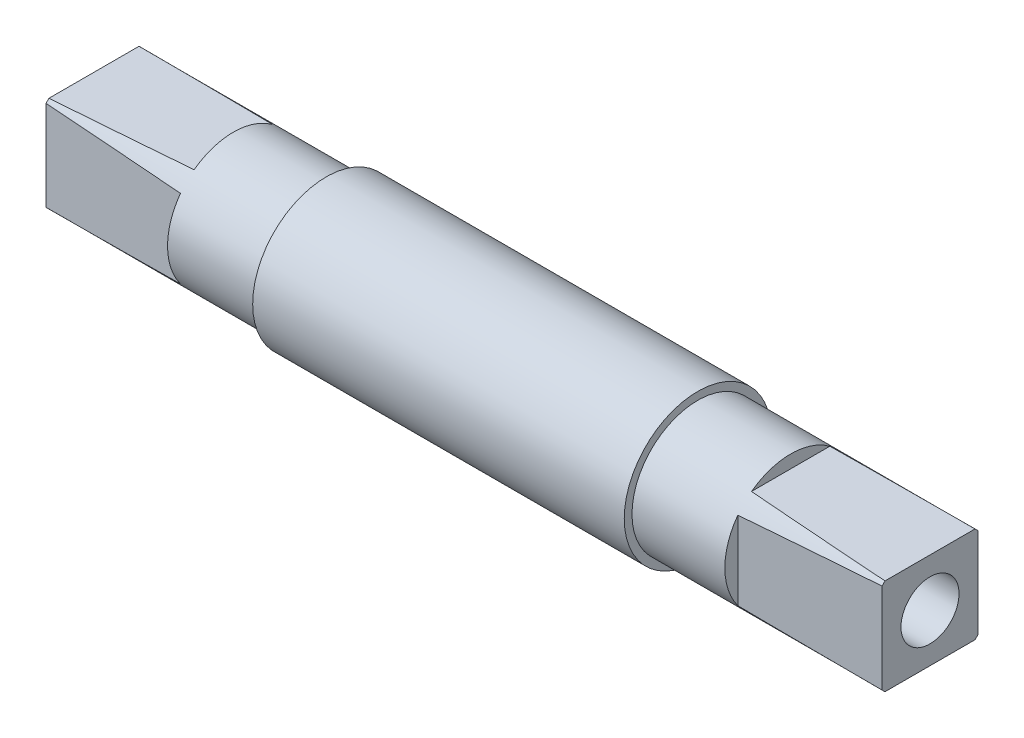
ISO-10303-21;
HEADER;
FILE_DESCRIPTION(('STEP AP214'),'2;1');
FILE_NAME('part.step','',(''),(''),'','','');
FILE_SCHEMA(('AUTOMOTIVE_DESIGN { 1 0 10303 214 1 1 1 1 }'));
ENDSEC;
DATA;
#1=APPLICATION_CONTEXT('core data for automotive mechanical design processes');
#2=APPLICATION_PROTOCOL_DEFINITION('international standard','automotive_design',2000,#1);
#3=PRODUCT_CONTEXT('',#1,'mechanical');
#4=PRODUCT('Part','Part','',(#3));
#5=PRODUCT_RELATED_PRODUCT_CATEGORY('part','',(#4));
#6=PRODUCT_DEFINITION_FORMATION('','',#4);
#7=PRODUCT_DEFINITION_CONTEXT('part definition',#1,'design');
#8=PRODUCT_DEFINITION('design','',#6,#7);
#9=PRODUCT_DEFINITION_SHAPE('','',#8);
#10=(LENGTH_UNIT() NAMED_UNIT(*) SI_UNIT(.MILLI.,.METRE.));
#11=(NAMED_UNIT(*) PLANE_ANGLE_UNIT() SI_UNIT($,.RADIAN.));
#12=(NAMED_UNIT(*) SI_UNIT($,.STERADIAN.) SOLID_ANGLE_UNIT());
#13=UNCERTAINTY_MEASURE_WITH_UNIT(LENGTH_MEASURE(1.E-05),#10,'distance_accuracy_value','');
#14=(GEOMETRIC_REPRESENTATION_CONTEXT(3) GLOBAL_UNCERTAINTY_ASSIGNED_CONTEXT((#13)) GLOBAL_UNIT_ASSIGNED_CONTEXT((#10,
#11,#12)) REPRESENTATION_CONTEXT('',''));
#15=CARTESIAN_POINT('',(0.,0.,0.));
#16=DIRECTION('',(0.,0.,1.));
#17=DIRECTION('',(1.,0.,0.));
#18=AXIS2_PLACEMENT_3D('',#15,#16,#17);
#19=CARTESIAN_POINT('',(-69.5075980392157,0.,0.));
#20=DIRECTION('',(-1.,0.,0.));
#21=DIRECTION('',(0.,0.,1.));
#22=AXIS2_PLACEMENT_3D('',#19,#20,#21);
#23=CYLINDRICAL_SURFACE('',#22,3.5);
#24=CARTESIAN_POINT('',(42.,0.,0.));
#25=DIRECTION('',(-1.,0.,0.));
#26=DIRECTION('',(0.,0.,1.));
#27=AXIS2_PLACEMENT_3D('',#24,#25,#26);
#28=CIRCLE('',#27,3.5);
#29=CARTESIAN_POINT('',(42.,0.,3.5));
#30=VERTEX_POINT('',#29);
#31=EDGE_CURVE('E19',#30,#30,#28,.F.);
#32=ORIENTED_EDGE('',*,*,#31,.T.);
#33=EDGE_LOOP('',(#32));
#34=FACE_BOUND('',#33,.T.);
#35=CARTESIAN_POINT('',(-42.,0.,0.));
#36=DIRECTION('',(-1.,0.,0.));
#37=DIRECTION('',(0.,0.,1.));
#38=AXIS2_PLACEMENT_3D('',#35,#36,#37);
#39=CIRCLE('',#38,3.5);
#40=CARTESIAN_POINT('',(-42.,0.,3.5));
#41=VERTEX_POINT('',#40);
#42=EDGE_CURVE('E215',#41,#41,#39,.T.);
#43=ORIENTED_EDGE('',*,*,#42,.T.);
#44=EDGE_LOOP('',(#43));
#45=FACE_BOUND('',#44,.T.);
#46=ADVANCED_FACE('F16',(#34,#45),#23,.F.);
#47=CARTESIAN_POINT('',(42.,3.75,0.));
#48=DIRECTION('',(-1.,0.,0.));
#49=DIRECTION('',(0.,0.,1.));
#50=AXIS2_PLACEMENT_3D('',#47,#48,#49);
#51=PLANE('',#50);
#52=ORIENTED_EDGE('',*,*,#31,.F.);
#53=EDGE_LOOP('',(#52));
#54=FACE_BOUND('',#53,.T.);
#55=CARTESIAN_POINT('',(42.,0.,0.));
#56=DIRECTION('',(-1.,0.,0.));
#57=DIRECTION('',(0.,0.,1.));
#58=AXIS2_PLACEMENT_3D('',#55,#56,#57);
#59=CIRCLE('',#58,3.75);
#60=CARTESIAN_POINT('',(42.,0.,3.75));
#61=VERTEX_POINT('',#60);
#62=EDGE_CURVE('E213',#61,#61,#59,.F.);
#63=ORIENTED_EDGE('',*,*,#62,.T.);
#64=EDGE_LOOP('',(#63));
#65=FACE_BOUND('',#64,.T.);
#66=ADVANCED_FACE('F223',(#54,#65),#51,.F.);
#67=CARTESIAN_POINT('',(-42.,3.74999999999999,0.));
#68=DIRECTION('',(1.,0.,0.));
#69=DIRECTION('',(0.,0.,-1.));
#70=AXIS2_PLACEMENT_3D('',#67,#68,#69);
#71=PLANE('',#70);
#72=CARTESIAN_POINT('',(-42.,0.,0.));
#73=DIRECTION('',(-1.,0.,0.));
#74=DIRECTION('',(0.,0.,1.));
#75=AXIS2_PLACEMENT_3D('',#72,#73,#74);
#76=CIRCLE('',#75,3.74999999999999);
#77=CARTESIAN_POINT('',(-42.,0.,3.74999999999999));
#78=VERTEX_POINT('',#77);
#79=EDGE_CURVE('E140',#78,#78,#76,.T.);
#80=ORIENTED_EDGE('',*,*,#79,.T.);
#81=EDGE_LOOP('',(#80));
#82=FACE_BOUND('',#81,.T.);
#83=ORIENTED_EDGE('',*,*,#42,.F.);
#84=EDGE_LOOP('',(#83));
#85=FACE_BOUND('',#84,.T.);
#86=ADVANCED_FACE('F226',(#82,#85),#71,.F.);
#87=CARTESIAN_POINT('',(-69.5075980392157,0.,0.));
#88=DIRECTION('',(-1.,0.,0.));
#89=DIRECTION('',(0.,0.,1.));
#90=AXIS2_PLACEMENT_3D('',#87,#88,#89);
#91=CYLINDRICAL_SURFACE('',#90,3.75);
#92=CARTESIAN_POINT('',(54.,0.,0.));
#93=DIRECTION('',(-1.,0.,0.));
#94=DIRECTION('',(0.,0.,1.));
#95=AXIS2_PLACEMENT_3D('',#92,#93,#94);
#96=CIRCLE('',#95,3.75);
#97=CARTESIAN_POINT('',(54.,0.,3.75));
#98=VERTEX_POINT('',#97);
#99=EDGE_CURVE('E203',#98,#98,#96,.F.);
#100=ORIENTED_EDGE('',*,*,#99,.T.);
#101=EDGE_LOOP('',(#100));
#102=FACE_BOUND('',#101,.T.);
#103=ORIENTED_EDGE('',*,*,#62,.F.);
#104=EDGE_LOOP('',(#103));
#105=FACE_BOUND('',#104,.T.);
#106=ADVANCED_FACE('F229',(#102,#105),#91,.F.);
#107=CARTESIAN_POINT('',(-69.5075980392157,0.,0.));
#108=DIRECTION('',(-1.,0.,0.));
#109=DIRECTION('',(0.,0.,1.));
#110=AXIS2_PLACEMENT_3D('',#107,#108,#109);
#111=CYLINDRICAL_SURFACE('',#110,3.74999999999999);
#112=ORIENTED_EDGE('',*,*,#79,.F.);
#113=EDGE_LOOP('',(#112));
#114=FACE_BOUND('',#113,.T.);
#115=CARTESIAN_POINT('',(-54.,0.,0.));
#116=DIRECTION('',(-1.,0.,0.));
#117=DIRECTION('',(0.,0.,1.));
#118=AXIS2_PLACEMENT_3D('',#115,#116,#117);
#119=CIRCLE('',#118,3.74999999999999);
#120=CARTESIAN_POINT('',(-54.,0.,3.74999999999999));
#121=VERTEX_POINT('',#120);
#122=EDGE_CURVE('E200',#121,#121,#119,.T.);
#123=ORIENTED_EDGE('',*,*,#122,.T.);
#124=EDGE_LOOP('',(#123));
#125=FACE_BOUND('',#124,.T.);
#126=ADVANCED_FACE('F231',(#114,#125),#111,.F.);
#127=CARTESIAN_POINT('',(54.,3.75,0.));
#128=DIRECTION('',(-1.,0.,0.));
#129=DIRECTION('',(0.,0.,1.));
#130=AXIS2_PLACEMENT_3D('',#127,#128,#129);
#131=PLANE('',#130);
#132=ORIENTED_EDGE('',*,*,#99,.F.);
#133=EDGE_LOOP('',(#132));
#134=FACE_BOUND('',#133,.T.);
#135=DIRECTION('',(0.,1.,0.));
#136=VECTOR('',#135,1.);
#137=CARTESIAN_POINT('',(54.,9.50000000000001,6.20000000000003));
#138=LINE('',#137,#136);
#139=CARTESIAN_POINT('',(54.,5.81463670404263,6.20000000000002));
#140=VERTEX_POINT('',#139);
#141=CARTESIAN_POINT('',(54.,-5.81463670404268,6.19999999999998));
#142=VERTEX_POINT('',#141);
#143=EDGE_CURVE('E574',#140,#142,#138,.F.);
#144=ORIENTED_EDGE('',*,*,#143,.T.);
#145=CARTESIAN_POINT('',(54.,0.,0.));
#146=DIRECTION('',(-1.,0.,0.));
#147=DIRECTION('',(0.,0.,1.));
#148=AXIS2_PLACEMENT_3D('',#145,#146,#147);
#149=CIRCLE('',#148,8.5);
#150=CARTESIAN_POINT('',(54.,-6.20000000000004,5.81463670404261));
#151=VERTEX_POINT('',#150);
#152=EDGE_CURVE('E208',#151,#142,#149,.T.);
#153=ORIENTED_EDGE('',*,*,#152,.F.);
#154=DIRECTION('',(0.,0.,1.));
#155=VECTOR('',#154,1.);
#156=CARTESIAN_POINT('',(54.,-6.20000000000007,9.50000000000002));
#157=LINE('',#156,#155);
#158=CARTESIAN_POINT('',(54.,-6.19999999999996,-5.8146367040427));
#159=VERTEX_POINT('',#158);
#160=EDGE_CURVE('E193',#151,#159,#157,.F.);
#161=ORIENTED_EDGE('',*,*,#160,.T.);
#162=CARTESIAN_POINT('',(54.,0.,0.));
#163=DIRECTION('',(-1.,0.,0.));
#164=DIRECTION('',(0.,0.,1.));
#165=AXIS2_PLACEMENT_3D('',#162,#163,#164);
#166=CIRCLE('',#165,8.5);
#167=CARTESIAN_POINT('',(54.,-5.81463670404259,-6.20000000000006));
#168=VERTEX_POINT('',#167);
#169=EDGE_CURVE('E139',#168,#159,#166,.T.);
#170=ORIENTED_EDGE('',*,*,#169,.F.);
#171=DIRECTION('',(0.,1.,0.));
#172=VECTOR('',#171,1.);
#173=CARTESIAN_POINT('',(54.,-9.50000000000003,-6.2000000000001));
#174=LINE('',#173,#172);
#175=CARTESIAN_POINT('',(54.,5.81463670404272,-6.19999999999994));
#176=VERTEX_POINT('',#175);
#177=EDGE_CURVE('E143',#168,#176,#174,.T.);
#178=ORIENTED_EDGE('',*,*,#177,.T.);
#179=CARTESIAN_POINT('',(54.,0.,0.));
#180=DIRECTION('',(-1.,0.,0.));
#181=DIRECTION('',(0.,0.,1.));
#182=AXIS2_PLACEMENT_3D('',#179,#180,#181);
#183=CIRCLE('',#182,8.5);
#184=CARTESIAN_POINT('',(54.,6.2,-5.81463670404266));
#185=VERTEX_POINT('',#184);
#186=EDGE_CURVE('E128',#185,#176,#183,.T.);
#187=ORIENTED_EDGE('',*,*,#186,.F.);
#188=DIRECTION('',(0.,0.,1.));
#189=VECTOR('',#188,1.);
#190=CARTESIAN_POINT('',(54.,6.2,-9.5));
#191=LINE('',#190,#189);
#192=CARTESIAN_POINT('',(54.,6.2,5.81463670404265));
#193=VERTEX_POINT('',#192);
#194=EDGE_CURVE('E570',#185,#193,#191,.T.);
#195=ORIENTED_EDGE('',*,*,#194,.T.);
#196=CARTESIAN_POINT('',(54.,0.,0.));
#197=DIRECTION('',(-1.,0.,0.));
#198=DIRECTION('',(0.,0.,1.));
#199=AXIS2_PLACEMENT_3D('',#196,#197,#198);
#200=CIRCLE('',#199,8.5);
#201=EDGE_CURVE('E206',#140,#193,#200,.T.);
#202=ORIENTED_EDGE('',*,*,#201,.F.);
#203=EDGE_LOOP('',(#144,#153,#161,#170,#178,#187,#195,#202));
#204=FACE_BOUND('',#203,.T.);
#205=ADVANCED_FACE('F145',(#134,#204),#131,.F.);
#206=CARTESIAN_POINT('',(-54.,3.74999999999999,0.));
#207=DIRECTION('',(1.,0.,0.));
#208=DIRECTION('',(0.,0.,-1.));
#209=AXIS2_PLACEMENT_3D('',#206,#207,#208);
#210=PLANE('',#209);
#211=CARTESIAN_POINT('',(-54.,0.,0.));
#212=DIRECTION('',(-1.,0.,0.));
#213=DIRECTION('',(0.,0.,1.));
#214=AXIS2_PLACEMENT_3D('',#211,#212,#213);
#215=CIRCLE('',#214,8.49999999999999);
#216=CARTESIAN_POINT('',(-54.,6.2,5.81463670404264));
#217=VERTEX_POINT('',#216);
#218=CARTESIAN_POINT('',(-54.,5.81463670404262,6.20000000000002));
#219=VERTEX_POINT('',#218);
#220=EDGE_CURVE('E191',#217,#219,#215,.F.);
#221=ORIENTED_EDGE('',*,*,#220,.F.);
#222=DIRECTION('',(0.,0.,1.));
#223=VECTOR('',#222,1.);
#224=CARTESIAN_POINT('',(-54.,6.2,-9.5));
#225=LINE('',#224,#223);
#226=CARTESIAN_POINT('',(-54.,6.2,-5.81463670404264));
#227=VERTEX_POINT('',#226);
#228=EDGE_CURVE('E517',#227,#217,#225,.T.);
#229=ORIENTED_EDGE('',*,*,#228,.F.);
#230=CARTESIAN_POINT('',(-54.,0.,0.));
#231=DIRECTION('',(-1.,0.,0.));
#232=DIRECTION('',(0.,0.,1.));
#233=AXIS2_PLACEMENT_3D('',#230,#231,#232);
#234=CIRCLE('',#233,8.49999999999999);
#235=CARTESIAN_POINT('',(-54.,5.8146367040427,-6.19999999999994));
#236=VERTEX_POINT('',#235);
#237=EDGE_CURVE('E194',#236,#227,#234,.F.);
#238=ORIENTED_EDGE('',*,*,#237,.F.);
#239=DIRECTION('',(0.,1.,0.));
#240=VECTOR('',#239,1.);
#241=CARTESIAN_POINT('',(-54.,-9.50000000000003,-6.2000000000001));
#242=LINE('',#241,#240);
#243=CARTESIAN_POINT('',(-54.,-5.81463670404257,-6.20000000000006));
#244=VERTEX_POINT('',#243);
#245=EDGE_CURVE('E590',#244,#236,#242,.T.);
#246=ORIENTED_EDGE('',*,*,#245,.F.);
#247=CARTESIAN_POINT('',(-54.,0.,0.));
#248=DIRECTION('',(-1.,0.,0.));
#249=DIRECTION('',(0.,0.,1.));
#250=AXIS2_PLACEMENT_3D('',#247,#248,#249);
#251=CIRCLE('',#250,8.49999999999999);
#252=CARTESIAN_POINT('',(-54.,-6.19999999999996,-5.81463670404268));
#253=VERTEX_POINT('',#252);
#254=EDGE_CURVE('E196',#253,#244,#251,.F.);
#255=ORIENTED_EDGE('',*,*,#254,.F.);
#256=DIRECTION('',(0.,0.,1.));
#257=VECTOR('',#256,1.);
#258=CARTESIAN_POINT('',(-54.,-6.20000000000007,9.50000000000002));
#259=LINE('',#258,#257);
#260=CARTESIAN_POINT('',(-54.,-6.20000000000004,5.8146367040426));
#261=VERTEX_POINT('',#260);
#262=EDGE_CURVE('E561',#261,#253,#259,.F.);
#263=ORIENTED_EDGE('',*,*,#262,.F.);
#264=CARTESIAN_POINT('',(-54.,0.,0.));
#265=DIRECTION('',(-1.,0.,0.));
#266=DIRECTION('',(0.,0.,1.));
#267=AXIS2_PLACEMENT_3D('',#264,#265,#266);
#268=CIRCLE('',#267,8.49999999999999);
#269=CARTESIAN_POINT('',(-54.,-5.81463670404266,6.19999999999998));
#270=VERTEX_POINT('',#269);
#271=EDGE_CURVE('E198',#270,#261,#268,.F.);
#272=ORIENTED_EDGE('',*,*,#271,.F.);
#273=DIRECTION('',(0.,1.,0.));
#274=VECTOR('',#273,1.);
#275=CARTESIAN_POINT('',(-54.,9.50000000000001,6.20000000000003));
#276=LINE('',#275,#274);
#277=EDGE_CURVE('E520',#219,#270,#276,.F.);
#278=ORIENTED_EDGE('',*,*,#277,.F.);
#279=EDGE_LOOP('',(#221,#229,#238,#246,#255,#263,#272,#278));
#280=FACE_BOUND('',#279,.T.);
#281=ORIENTED_EDGE('',*,*,#122,.F.);
#282=EDGE_LOOP('',(#281));
#283=FACE_BOUND('',#282,.T.);
#284=ADVANCED_FACE('F326',(#280,#283),#210,.F.);
#285=CARTESIAN_POINT('',(36.,9.49999999999998,14.7690514733654));
#286=DIRECTION('',(-1.,0.,0.));
#287=DIRECTION('',(0.,0.,1.));
#288=AXIS2_PLACEMENT_3D('',#285,#286,#287);
#289=PLANE('',#288);
#290=CARTESIAN_POINT('',(36.,0.,0.));
#291=DIRECTION('',(-1.,0.,0.));
#292=DIRECTION('',(0.,0.,1.));
#293=AXIS2_PLACEMENT_3D('',#290,#291,#292);
#294=CIRCLE('',#293,8.5);
#295=CARTESIAN_POINT('',(36.,-6.82857385085129,-5.0616775048861));
#296=VERTEX_POINT('',#295);
#297=CARTESIAN_POINT('',(36.,-6.82857385085136,5.06167750488601));
#298=VERTEX_POINT('',#297);
#299=EDGE_CURVE('E183',#296,#298,#294,.T.);
#300=ORIENTED_EDGE('',*,*,#299,.F.);
#301=DIRECTION('',(0.,0.,1.));
#302=VECTOR('',#301,1.);
#303=CARTESIAN_POINT('',(36.,-6.8285738508514,9.50000000000002));
#304=LINE('',#303,#302);
#305=EDGE_CURVE('E576',#296,#298,#304,.T.);
#306=ORIENTED_EDGE('',*,*,#305,.T.);
#307=EDGE_LOOP('',(#300,#306));
#308=FACE_BOUND('',#307,.T.);
#309=ADVANCED_FACE('F322',(#308),#289,.F.);
#310=CARTESIAN_POINT('',(36.,-6.8285738508514,9.50000000000002));
#311=DIRECTION('',(-0.0348994967024938,0.999390827019096,0.));
#312=DIRECTION('',(-0.999390827019096,-0.0348994967024938,0.));
#313=AXIS2_PLACEMENT_3D('',#310,#311,#312);
#314=PLANE('',#313);
#315=CARTESIAN_POINT('',(231.544770354113,0.,0.));
#316=DIRECTION('',(-0.0348994967024938,0.999390827019096,0.));
#317=DIRECTION('',(-0.999390827019096,-0.0348994967024938,0.));
#318=AXIS2_PLACEMENT_3D('',#315,#316,#317);
#319=ELLIPSE('',#318,243.556520956723,8.5);
#320=EDGE_CURVE('E186',#159,#296,#319,.T.);
#321=ORIENTED_EDGE('',*,*,#320,.F.);
#322=ORIENTED_EDGE('',*,*,#160,.F.);
#323=CARTESIAN_POINT('',(231.544770354113,0.,0.));
#324=DIRECTION('',(-0.0348994967024938,0.999390827019096,0.));
#325=DIRECTION('',(-0.999390827019096,-0.0348994967024938,0.));
#326=AXIS2_PLACEMENT_3D('',#323,#324,#325);
#327=ELLIPSE('',#326,243.556520956723,8.5);
#328=EDGE_CURVE('E180',#298,#151,#327,.T.);
#329=ORIENTED_EDGE('',*,*,#328,.F.);
#330=ORIENTED_EDGE('',*,*,#305,.F.);
#331=EDGE_LOOP('',(#321,#322,#329,#330));
#332=FACE_BOUND('',#331,.T.);
#333=ADVANCED_FACE('F318',(#332),#314,.F.);
#334=CARTESIAN_POINT('',(36.,9.49999999999998,14.7690514733654));
#335=DIRECTION('',(-1.,0.,0.));
#336=DIRECTION('',(0.,0.,1.));
#337=AXIS2_PLACEMENT_3D('',#334,#335,#336);
#338=PLANE('',#337);
#339=DIRECTION('',(0.,1.,0.));
#340=VECTOR('',#339,1.);
#341=CARTESIAN_POINT('',(36.,-9.50000000000003,-6.82857385085143));
#342=LINE('',#341,#340);
#343=CARTESIAN_POINT('',(36.,5.06167750488612,-6.82857385085128));
#344=VERTEX_POINT('',#343);
#345=CARTESIAN_POINT('',(36.,-5.06167750488598,-6.82857385085138));
#346=VERTEX_POINT('',#345);
#347=EDGE_CURVE('E150',#344,#346,#342,.F.);
#348=ORIENTED_EDGE('',*,*,#347,.T.);
#349=CARTESIAN_POINT('',(36.,0.,0.));
#350=DIRECTION('',(-1.,0.,0.));
#351=DIRECTION('',(0.,0.,1.));
#352=AXIS2_PLACEMENT_3D('',#349,#350,#351);
#353=CIRCLE('',#352,8.5);
#354=EDGE_CURVE('E175',#344,#346,#353,.T.);
#355=ORIENTED_EDGE('',*,*,#354,.F.);
#356=EDGE_LOOP('',(#348,#355));
#357=FACE_BOUND('',#356,.T.);
#358=ADVANCED_FACE('F314',(#357),#338,.F.);
#359=CARTESIAN_POINT('',(36.,9.49999999999998,14.7690514733654));
#360=DIRECTION('',(-1.,0.,0.));
#361=DIRECTION('',(0.,0.,1.));
#362=AXIS2_PLACEMENT_3D('',#359,#360,#361);
#363=PLANE('',#362);
#364=CARTESIAN_POINT('',(36.,0.,0.));
#365=DIRECTION('',(-1.,0.,0.));
#366=DIRECTION('',(0.,0.,1.));
#367=AXIS2_PLACEMENT_3D('',#364,#365,#366);
#368=CIRCLE('',#367,8.5);
#369=CARTESIAN_POINT('',(36.,-5.06167750488607,6.82857385085131));
#370=VERTEX_POINT('',#369);
#371=CARTESIAN_POINT('',(36.,5.06167750488603,6.82857385085135));
#372=VERTEX_POINT('',#371);
#373=EDGE_CURVE('E172',#370,#372,#368,.T.);
#374=ORIENTED_EDGE('',*,*,#373,.F.);
#375=DIRECTION('',(0.,1.,0.));
#376=VECTOR('',#375,1.);
#377=CARTESIAN_POINT('',(36.,9.50000000000001,6.82857385085136));
#378=LINE('',#377,#376);
#379=EDGE_CURVE('E572',#370,#372,#378,.T.);
#380=ORIENTED_EDGE('',*,*,#379,.T.);
#381=EDGE_LOOP('',(#374,#380));
#382=FACE_BOUND('',#381,.T.);
#383=ADVANCED_FACE('F310',(#382),#363,.F.);
#384=CARTESIAN_POINT('',(36.,9.50000000000001,6.82857385085136));
#385=DIRECTION('',(-0.0348994967024938,0.,-0.999390827019096));
#386=DIRECTION('',(-0.999390827019096,0.,0.0348994967024938));
#387=AXIS2_PLACEMENT_3D('',#384,#385,#386);
#388=PLANE('',#387);
#389=CARTESIAN_POINT('',(231.544770354113,0.,0.));
#390=DIRECTION('',(-0.0348994967024938,0.,-0.999390827019096));
#391=DIRECTION('',(-0.999390827019096,0.,0.0348994967024938));
#392=AXIS2_PLACEMENT_3D('',#389,#390,#391);
#393=ELLIPSE('',#392,243.556520956723,8.5);
#394=EDGE_CURVE('E177',#142,#370,#393,.T.);
#395=ORIENTED_EDGE('',*,*,#394,.F.);
#396=ORIENTED_EDGE('',*,*,#143,.F.);
#397=CARTESIAN_POINT('',(231.544770354113,0.,0.));
#398=DIRECTION('',(-0.0348994967024938,0.,-0.999390827019096));
#399=DIRECTION('',(-0.999390827019096,0.,0.0348994967024938));
#400=AXIS2_PLACEMENT_3D('',#397,#398,#399);
#401=ELLIPSE('',#400,243.556520956723,8.5);
#402=EDGE_CURVE('E169',#372,#140,#401,.T.);
#403=ORIENTED_EDGE('',*,*,#402,.F.);
#404=ORIENTED_EDGE('',*,*,#379,.F.);
#405=EDGE_LOOP('',(#395,#396,#403,#404));
#406=FACE_BOUND('',#405,.T.);
#407=ADVANCED_FACE('F306',(#406),#388,.F.);
#408=CARTESIAN_POINT('',(36.,14.7690514733654,-9.5));
#409=DIRECTION('',(-1.,0.,0.));
#410=DIRECTION('',(0.,0.,1.));
#411=AXIS2_PLACEMENT_3D('',#408,#409,#410);
#412=PLANE('',#411);
#413=CARTESIAN_POINT('',(36.,0.,0.));
#414=DIRECTION('',(-1.,0.,0.));
#415=DIRECTION('',(0.,0.,1.));
#416=AXIS2_PLACEMENT_3D('',#413,#414,#415);
#417=CIRCLE('',#416,8.5);
#418=CARTESIAN_POINT('',(36.,6.82857385085133,5.06167750488605));
#419=VERTEX_POINT('',#418);
#420=CARTESIAN_POINT('',(36.,6.82857385085133,-5.06167750488605));
#421=VERTEX_POINT('',#420);
#422=EDGE_CURVE('E161',#419,#421,#417,.T.);
#423=ORIENTED_EDGE('',*,*,#422,.F.);
#424=DIRECTION('',(0.,0.,1.));
#425=VECTOR('',#424,1.);
#426=CARTESIAN_POINT('',(36.,6.82857385085133,-9.5));
#427=LINE('',#426,#425);
#428=EDGE_CURVE('E151',#419,#421,#427,.F.);
#429=ORIENTED_EDGE('',*,*,#428,.T.);
#430=EDGE_LOOP('',(#423,#429));
#431=FACE_BOUND('',#430,.T.);
#432=ADVANCED_FACE('F302',(#431),#412,.F.);
#433=CARTESIAN_POINT('',(36.,6.82857385085133,-9.5));
#434=DIRECTION('',(-0.0348994967024938,-0.999390827019096,0.));
#435=DIRECTION('',(0.999390827019096,-0.0348994967024938,0.));
#436=AXIS2_PLACEMENT_3D('',#433,#434,#435);
#437=PLANE('',#436);
#438=CARTESIAN_POINT('',(231.544770354113,0.,0.));
#439=DIRECTION('',(-0.0348994967024938,-0.999390827019096,0.));
#440=DIRECTION('',(-0.999390827019096,0.0348994967024938,0.));
#441=AXIS2_PLACEMENT_3D('',#438,#439,#440);
#442=ELLIPSE('',#441,243.556520956723,8.5);
#443=EDGE_CURVE('E166',#193,#419,#442,.T.);
#444=ORIENTED_EDGE('',*,*,#443,.F.);
#445=ORIENTED_EDGE('',*,*,#194,.F.);
#446=CARTESIAN_POINT('',(231.544770354113,0.,0.));
#447=DIRECTION('',(-0.0348994967024938,-0.999390827019096,0.));
#448=DIRECTION('',(-0.999390827019096,0.0348994967024938,0.));
#449=AXIS2_PLACEMENT_3D('',#446,#447,#448);
#450=ELLIPSE('',#449,243.556520956723,8.5);
#451=EDGE_CURVE('E138',#421,#185,#450,.T.);
#452=ORIENTED_EDGE('',*,*,#451,.F.);
#453=ORIENTED_EDGE('',*,*,#428,.F.);
#454=EDGE_LOOP('',(#444,#445,#452,#453));
#455=FACE_BOUND('',#454,.T.);
#456=ADVANCED_FACE('F299',(#455),#437,.F.);
#457=CARTESIAN_POINT('',(36.,-9.50000000000003,-6.82857385085143));
#458=DIRECTION('',(-0.0348994967024938,0.,0.999390827019096));
#459=DIRECTION('',(0.999390827019096,0.,0.0348994967024938));
#460=AXIS2_PLACEMENT_3D('',#457,#458,#459);
#461=PLANE('',#460);
#462=CARTESIAN_POINT('',(231.544770354113,0.,0.));
#463=DIRECTION('',(-0.0348994967024938,0.,0.999390827019096));
#464=DIRECTION('',(-0.999390827019096,0.,-0.0348994967024938));
#465=AXIS2_PLACEMENT_3D('',#462,#463,#464);
#466=ELLIPSE('',#465,243.556520956723,8.5);
#467=EDGE_CURVE('E135',#176,#344,#466,.T.);
#468=ORIENTED_EDGE('',*,*,#467,.F.);
#469=ORIENTED_EDGE('',*,*,#177,.F.);
#470=CARTESIAN_POINT('',(231.544770354113,0.,0.));
#471=DIRECTION('',(-0.0348994967024938,0.,0.999390827019096));
#472=DIRECTION('',(-0.999390827019096,0.,-0.0348994967024938));
#473=AXIS2_PLACEMENT_3D('',#470,#471,#472);
#474=ELLIPSE('',#473,243.556520956723,8.5);
#475=EDGE_CURVE('E189',#346,#168,#474,.T.);
#476=ORIENTED_EDGE('',*,*,#475,.F.);
#477=ORIENTED_EDGE('',*,*,#347,.F.);
#478=EDGE_LOOP('',(#468,#469,#476,#477));
#479=FACE_BOUND('',#478,.T.);
#480=ADVANCED_FACE('F154',(#479),#461,.F.);
#481=CARTESIAN_POINT('',(-36.,14.7690514733654,-9.5));
#482=DIRECTION('',(-1.,0.,0.));
#483=DIRECTION('',(0.,0.,1.));
#484=AXIS2_PLACEMENT_3D('',#481,#482,#483);
#485=PLANE('',#484);
#486=CARTESIAN_POINT('',(-36.,0.,0.));
#487=DIRECTION('',(-1.,0.,0.));
#488=DIRECTION('',(0.,0.,1.));
#489=AXIS2_PLACEMENT_3D('',#486,#487,#488);
#490=CIRCLE('',#489,8.49999999999999);
#491=CARTESIAN_POINT('',(-36.,-6.82857385085136,5.06167750488599));
#492=VERTEX_POINT('',#491);
#493=CARTESIAN_POINT('',(-36.,-6.82857385085129,-5.06167750488608));
#494=VERTEX_POINT('',#493);
#495=EDGE_CURVE('E553',#492,#494,#490,.F.);
#496=ORIENTED_EDGE('',*,*,#495,.F.);
#497=DIRECTION('',(0.,0.,1.));
#498=VECTOR('',#497,1.);
#499=CARTESIAN_POINT('',(-36.,-6.8285738508514,9.50000000000002));
#500=LINE('',#499,#498);
#501=EDGE_CURVE('E562',#494,#492,#500,.T.);
#502=ORIENTED_EDGE('',*,*,#501,.F.);
#503=EDGE_LOOP('',(#496,#502));
#504=FACE_BOUND('',#503,.T.);
#505=ADVANCED_FACE('F292',(#504),#485,.T.);
#506=CARTESIAN_POINT('',(-36.,-6.8285738508514,9.50000000000002));
#507=DIRECTION('',(-0.0348994967024938,-0.999390827019096,0.));
#508=DIRECTION('',(0.999390827019096,-0.0348994967024938,0.));
#509=AXIS2_PLACEMENT_3D('',#506,#507,#508);
#510=PLANE('',#509);
#511=CARTESIAN_POINT('',(-231.544770354113,0.,0.));
#512=DIRECTION('',(-0.0348994967024938,-0.999390827019096,0.));
#513=DIRECTION('',(-0.999390827019096,0.0348994967024938,0.));
#514=AXIS2_PLACEMENT_3D('',#511,#512,#513);
#515=ELLIPSE('',#514,243.556520956722,8.49999999999999);
#516=EDGE_CURVE('E159',#261,#492,#515,.F.);
#517=ORIENTED_EDGE('',*,*,#516,.F.);
#518=ORIENTED_EDGE('',*,*,#262,.T.);
#519=CARTESIAN_POINT('',(-231.544770354113,0.,0.));
#520=DIRECTION('',(-0.0348994967024938,-0.999390827019096,0.));
#521=DIRECTION('',(-0.999390827019096,0.0348994967024938,0.));
#522=AXIS2_PLACEMENT_3D('',#519,#520,#521);
#523=ELLIPSE('',#522,243.556520956722,8.49999999999999);
#524=EDGE_CURVE('E550',#494,#253,#523,.F.);
#525=ORIENTED_EDGE('',*,*,#524,.F.);
#526=ORIENTED_EDGE('',*,*,#501,.T.);
#527=EDGE_LOOP('',(#517,#518,#525,#526));
#528=FACE_BOUND('',#527,.T.);
#529=ADVANCED_FACE('F288',(#528),#510,.T.);
#530=CARTESIAN_POINT('',(-36.,14.7690514733654,-9.5));
#531=DIRECTION('',(-1.,0.,0.));
#532=DIRECTION('',(0.,0.,1.));
#533=AXIS2_PLACEMENT_3D('',#530,#531,#532);
#534=PLANE('',#533);
#535=CARTESIAN_POINT('',(-36.,0.,0.));
#536=DIRECTION('',(-1.,0.,0.));
#537=DIRECTION('',(0.,0.,1.));
#538=AXIS2_PLACEMENT_3D('',#535,#536,#537);
#539=CIRCLE('',#538,8.49999999999999);
#540=CARTESIAN_POINT('',(-36.,-5.06167750488596,-6.82857385085138));
#541=VERTEX_POINT('',#540);
#542=CARTESIAN_POINT('',(-36.,5.0616775048861,-6.82857385085128));
#543=VERTEX_POINT('',#542);
#544=EDGE_CURVE('E545',#541,#543,#539,.F.);
#545=ORIENTED_EDGE('',*,*,#544,.F.);
#546=DIRECTION('',(0.,1.,0.));
#547=VECTOR('',#546,1.);
#548=CARTESIAN_POINT('',(-36.,-9.50000000000003,-6.82857385085143));
#549=LINE('',#548,#547);
#550=EDGE_CURVE('E564',#543,#541,#549,.F.);
#551=ORIENTED_EDGE('',*,*,#550,.F.);
#552=EDGE_LOOP('',(#545,#551));
#553=FACE_BOUND('',#552,.T.);
#554=ADVANCED_FACE('F284',(#553),#534,.T.);
#555=CARTESIAN_POINT('',(-36.,-9.50000000000003,-6.82857385085143));
#556=DIRECTION('',(-0.0348994967024938,0.,-0.999390827019096));
#557=DIRECTION('',(-0.999390827019096,0.,0.0348994967024938));
#558=AXIS2_PLACEMENT_3D('',#555,#556,#557);
#559=PLANE('',#558);
#560=CARTESIAN_POINT('',(-231.544770354113,0.,0.));
#561=DIRECTION('',(-0.0348994967024938,0.,-0.999390827019096));
#562=DIRECTION('',(-0.999390827019096,0.,0.0348994967024938));
#563=AXIS2_PLACEMENT_3D('',#560,#561,#562);
#564=ELLIPSE('',#563,243.556520956722,8.49999999999999);
#565=EDGE_CURVE('E548',#244,#541,#564,.F.);
#566=ORIENTED_EDGE('',*,*,#565,.F.);
#567=ORIENTED_EDGE('',*,*,#245,.T.);
#568=CARTESIAN_POINT('',(-231.544770354113,0.,0.));
#569=DIRECTION('',(-0.0348994967024938,0.,-0.999390827019096));
#570=DIRECTION('',(-0.999390827019096,0.,0.0348994967024938));
#571=AXIS2_PLACEMENT_3D('',#568,#569,#570);
#572=ELLIPSE('',#571,243.556520956722,8.49999999999999);
#573=EDGE_CURVE('E542',#543,#236,#572,.F.);
#574=ORIENTED_EDGE('',*,*,#573,.F.);
#575=ORIENTED_EDGE('',*,*,#550,.T.);
#576=EDGE_LOOP('',(#566,#567,#574,#575));
#577=FACE_BOUND('',#576,.T.);
#578=ADVANCED_FACE('F280',(#577),#559,.T.);
#579=CARTESIAN_POINT('',(-36.,14.7690514733654,-9.5));
#580=DIRECTION('',(-1.,0.,0.));
#581=DIRECTION('',(0.,0.,1.));
#582=AXIS2_PLACEMENT_3D('',#579,#580,#581);
#583=PLANE('',#582);
#584=CARTESIAN_POINT('',(-36.,0.,0.));
#585=DIRECTION('',(-1.,0.,0.));
#586=DIRECTION('',(0.,0.,1.));
#587=AXIS2_PLACEMENT_3D('',#584,#585,#586);
#588=CIRCLE('',#587,8.49999999999999);
#589=CARTESIAN_POINT('',(-36.,6.82857385085133,-5.06167750488603));
#590=VERTEX_POINT('',#589);
#591=CARTESIAN_POINT('',(-36.,6.82857385085133,5.06167750488603));
#592=VERTEX_POINT('',#591);
#593=EDGE_CURVE('E533',#590,#592,#588,.F.);
#594=ORIENTED_EDGE('',*,*,#593,.F.);
#595=DIRECTION('',(0.,0.,1.));
#596=VECTOR('',#595,1.);
#597=CARTESIAN_POINT('',(-36.,6.82857385085133,-9.5));
#598=LINE('',#597,#596);
#599=EDGE_CURVE('E528',#592,#590,#598,.F.);
#600=ORIENTED_EDGE('',*,*,#599,.F.);
#601=EDGE_LOOP('',(#594,#600));
#602=FACE_BOUND('',#601,.T.);
#603=ADVANCED_FACE('F276',(#602),#583,.T.);
#604=CARTESIAN_POINT('',(-36.,6.82857385085133,-9.5));
#605=DIRECTION('',(-0.0348994967024938,0.999390827019096,0.));
#606=DIRECTION('',(-0.999390827019096,-0.0348994967024938,0.));
#607=AXIS2_PLACEMENT_3D('',#604,#605,#606);
#608=PLANE('',#607);
#609=CARTESIAN_POINT('',(-231.544770354113,0.,0.));
#610=DIRECTION('',(-0.0348994967024938,0.999390827019096,0.));
#611=DIRECTION('',(-0.999390827019096,-0.0348994967024938,0.));
#612=AXIS2_PLACEMENT_3D('',#609,#610,#611);
#613=ELLIPSE('',#612,243.556520956722,8.49999999999999);
#614=EDGE_CURVE('E527',#227,#590,#613,.F.);
#615=ORIENTED_EDGE('',*,*,#614,.F.);
#616=ORIENTED_EDGE('',*,*,#228,.T.);
#617=CARTESIAN_POINT('',(-231.544770354113,0.,0.));
#618=DIRECTION('',(-0.0348994967024938,0.999390827019096,0.));
#619=DIRECTION('',(-0.999390827019096,-0.0348994967024938,0.));
#620=AXIS2_PLACEMENT_3D('',#617,#618,#619);
#621=ELLIPSE('',#620,243.556520956722,8.49999999999999);
#622=EDGE_CURVE('E524',#592,#217,#621,.F.);
#623=ORIENTED_EDGE('',*,*,#622,.F.);
#624=ORIENTED_EDGE('',*,*,#599,.T.);
#625=EDGE_LOOP('',(#615,#616,#623,#624));
#626=FACE_BOUND('',#625,.T.);
#627=ADVANCED_FACE('F273',(#626),#608,.T.);
#628=CARTESIAN_POINT('',(-36.,9.50000000000001,6.82857385085136));
#629=DIRECTION('',(-0.0348994967024938,0.,0.999390827019096));
#630=DIRECTION('',(0.999390827019096,0.,0.0348994967024938));
#631=AXIS2_PLACEMENT_3D('',#628,#629,#630);
#632=PLANE('',#631);
#633=CARTESIAN_POINT('',(-231.544770354113,0.,0.));
#634=DIRECTION('',(-0.0348994967024938,0.,0.999390827019096));
#635=DIRECTION('',(-0.999390827019096,0.,-0.0348994967024938));
#636=AXIS2_PLACEMENT_3D('',#633,#634,#635);
#637=ELLIPSE('',#636,243.556520956722,8.49999999999999);
#638=CARTESIAN_POINT('',(-36.,5.06167750488601,6.82857385085135));
#639=VERTEX_POINT('',#638);
#640=EDGE_CURVE('E534',#219,#639,#637,.F.);
#641=ORIENTED_EDGE('',*,*,#640,.F.);
#642=ORIENTED_EDGE('',*,*,#277,.T.);
#643=CARTESIAN_POINT('',(-231.544770354113,0.,0.));
#644=DIRECTION('',(-0.0348994967024938,0.,0.999390827019096));
#645=DIRECTION('',(-0.999390827019096,0.,-0.0348994967024938));
#646=AXIS2_PLACEMENT_3D('',#643,#644,#645);
#647=ELLIPSE('',#646,243.556520956722,8.49999999999999);
#648=CARTESIAN_POINT('',(-36.,-5.06167750488604,6.82857385085133));
#649=VERTEX_POINT('',#648);
#650=EDGE_CURVE('E156',#649,#270,#647,.F.);
#651=ORIENTED_EDGE('',*,*,#650,.F.);
#652=DIRECTION('',(0.,1.,0.));
#653=VECTOR('',#652,1.);
#654=CARTESIAN_POINT('',(-36.,14.7690514733654,6.82857385085135));
#655=LINE('',#654,#653);
#656=EDGE_CURVE('E34',#639,#649,#655,.F.);
#657=ORIENTED_EDGE('',*,*,#656,.F.);
#658=EDGE_LOOP('',(#641,#642,#651,#657));
#659=FACE_BOUND('',#658,.T.);
#660=ADVANCED_FACE('F269',(#659),#632,.T.);
#661=CARTESIAN_POINT('',(-36.,14.7690514733654,-9.5));
#662=DIRECTION('',(-1.,0.,0.));
#663=DIRECTION('',(0.,0.,1.));
#664=AXIS2_PLACEMENT_3D('',#661,#662,#663);
#665=PLANE('',#664);
#666=CARTESIAN_POINT('',(-36.,0.,0.));
#667=DIRECTION('',(-1.,0.,0.));
#668=DIRECTION('',(0.,0.,1.));
#669=AXIS2_PLACEMENT_3D('',#666,#667,#668);
#670=CIRCLE('',#669,8.49999999999999);
#671=EDGE_CURVE('E536',#639,#649,#670,.F.);
#672=ORIENTED_EDGE('',*,*,#671,.F.);
#673=ORIENTED_EDGE('',*,*,#656,.T.);
#674=EDGE_LOOP('',(#672,#673));
#675=FACE_BOUND('',#674,.T.);
#676=ADVANCED_FACE('F265',(#675),#665,.T.);
#677=CARTESIAN_POINT('',(-69.5075980392157,0.,0.));
#678=DIRECTION('',(-1.,0.,0.));
#679=DIRECTION('',(0.,0.,1.));
#680=AXIS2_PLACEMENT_3D('',#677,#678,#679);
#681=CYLINDRICAL_SURFACE('',#680,8.5);
#682=CARTESIAN_POINT('',(24.,0.,0.));
#683=DIRECTION('',(-1.,0.,0.));
#684=DIRECTION('',(0.,0.,1.));
#685=AXIS2_PLACEMENT_3D('',#682,#683,#684);
#686=CIRCLE('',#685,8.5);
#687=CARTESIAN_POINT('',(24.,0.,8.5));
#688=VERTEX_POINT('',#687);
#689=EDGE_CURVE('E584',#688,#688,#686,.F.);
#690=ORIENTED_EDGE('',*,*,#689,.T.);
#691=EDGE_LOOP('',(#690));
#692=FACE_BOUND('',#691,.T.);
#693=ORIENTED_EDGE('',*,*,#186,.T.);
#694=ORIENTED_EDGE('',*,*,#467,.T.);
#695=ORIENTED_EDGE('',*,*,#354,.T.);
#696=ORIENTED_EDGE('',*,*,#475,.T.);
#697=ORIENTED_EDGE('',*,*,#169,.T.);
#698=ORIENTED_EDGE('',*,*,#320,.T.);
#699=ORIENTED_EDGE('',*,*,#299,.T.);
#700=ORIENTED_EDGE('',*,*,#328,.T.);
#701=ORIENTED_EDGE('',*,*,#152,.T.);
#702=ORIENTED_EDGE('',*,*,#394,.T.);
#703=ORIENTED_EDGE('',*,*,#373,.T.);
#704=ORIENTED_EDGE('',*,*,#402,.T.);
#705=ORIENTED_EDGE('',*,*,#201,.T.);
#706=ORIENTED_EDGE('',*,*,#443,.T.);
#707=ORIENTED_EDGE('',*,*,#422,.T.);
#708=ORIENTED_EDGE('',*,*,#451,.T.);
#709=EDGE_LOOP('',(#693,#694,#695,#696,#697,#698,#699,#700,#701,#702,#703,#704,#705,#706,#707,#708));
#710=FACE_BOUND('',#709,.T.);
#711=ADVANCED_FACE('F133',(#692,#710),#681,.T.);
#712=CARTESIAN_POINT('',(-69.5075980392157,0.,0.));
#713=DIRECTION('',(-1.,0.,0.));
#714=DIRECTION('',(0.,0.,1.));
#715=AXIS2_PLACEMENT_3D('',#712,#713,#714);
#716=CYLINDRICAL_SURFACE('',#715,8.49999999999999);
#717=ORIENTED_EDGE('',*,*,#565,.T.);
#718=ORIENTED_EDGE('',*,*,#544,.T.);
#719=ORIENTED_EDGE('',*,*,#573,.T.);
#720=ORIENTED_EDGE('',*,*,#237,.T.);
#721=ORIENTED_EDGE('',*,*,#614,.T.);
#722=ORIENTED_EDGE('',*,*,#593,.T.);
#723=ORIENTED_EDGE('',*,*,#622,.T.);
#724=ORIENTED_EDGE('',*,*,#220,.T.);
#725=ORIENTED_EDGE('',*,*,#640,.T.);
#726=ORIENTED_EDGE('',*,*,#671,.T.);
#727=ORIENTED_EDGE('',*,*,#650,.T.);
#728=ORIENTED_EDGE('',*,*,#271,.T.);
#729=ORIENTED_EDGE('',*,*,#516,.T.);
#730=ORIENTED_EDGE('',*,*,#495,.T.);
#731=ORIENTED_EDGE('',*,*,#524,.T.);
#732=ORIENTED_EDGE('',*,*,#254,.T.);
#733=EDGE_LOOP('',(#717,#718,#719,#720,#721,#722,#723,#724,#725,#726,#727,#728,#729,#730,#731,#732));
#734=FACE_BOUND('',#733,.T.);
#735=CARTESIAN_POINT('',(-24.,0.,0.));
#736=DIRECTION('',(-1.,0.,0.));
#737=DIRECTION('',(0.,0.,1.));
#738=AXIS2_PLACEMENT_3D('',#735,#736,#737);
#739=CIRCLE('',#738,8.49999999999999);
#740=CARTESIAN_POINT('',(-24.,0.,8.49999999999999));
#741=VERTEX_POINT('',#740);
#742=EDGE_CURVE('E581',#741,#741,#739,.T.);
#743=ORIENTED_EDGE('',*,*,#742,.T.);
#744=EDGE_LOOP('',(#743));
#745=FACE_BOUND('',#744,.T.);
#746=ADVANCED_FACE('F258',(#734,#745),#716,.T.);
#747=CARTESIAN_POINT('',(24.,8.5,0.));
#748=DIRECTION('',(-1.,0.,0.));
#749=DIRECTION('',(0.,0.,1.));
#750=AXIS2_PLACEMENT_3D('',#747,#748,#749);
#751=PLANE('',#750);
#752=ORIENTED_EDGE('',*,*,#689,.F.);
#753=EDGE_LOOP('',(#752));
#754=FACE_BOUND('',#753,.T.);
#755=CARTESIAN_POINT('',(24.,0.,0.));
#756=DIRECTION('',(-1.,0.,0.));
#757=DIRECTION('',(0.,0.,1.));
#758=AXIS2_PLACEMENT_3D('',#755,#756,#757);
#759=CIRCLE('',#758,9.5);
#760=CARTESIAN_POINT('',(24.,0.,9.5));
#761=VERTEX_POINT('',#760);
#762=EDGE_CURVE('E25',#761,#761,#759,.T.);
#763=ORIENTED_EDGE('',*,*,#762,.F.);
#764=EDGE_LOOP('',(#763));
#765=FACE_BOUND('',#764,.T.);
#766=ADVANCED_FACE('F251',(#754,#765),#751,.F.);
#767=CARTESIAN_POINT('',(-24.,8.49999999999999,0.));
#768=DIRECTION('',(1.,0.,0.));
#769=DIRECTION('',(0.,0.,-1.));
#770=AXIS2_PLACEMENT_3D('',#767,#768,#769);
#771=PLANE('',#770);
#772=CARTESIAN_POINT('',(-24.,0.,0.));
#773=DIRECTION('',(-1.,0.,0.));
#774=DIRECTION('',(0.,0.,1.));
#775=AXIS2_PLACEMENT_3D('',#772,#773,#774);
#776=CIRCLE('',#775,9.5);
#777=CARTESIAN_POINT('',(-24.,0.,9.5));
#778=VERTEX_POINT('',#777);
#779=EDGE_CURVE('E11',#778,#778,#776,.F.);
#780=ORIENTED_EDGE('',*,*,#779,.F.);
#781=EDGE_LOOP('',(#780));
#782=FACE_BOUND('',#781,.T.);
#783=ORIENTED_EDGE('',*,*,#742,.F.);
#784=EDGE_LOOP('',(#783));
#785=FACE_BOUND('',#784,.T.);
#786=ADVANCED_FACE('F245',(#782,#785),#771,.F.);
#787=CARTESIAN_POINT('',(-69.5075980392157,0.,0.));
#788=DIRECTION('',(-1.,0.,0.));
#789=DIRECTION('',(0.,0.,1.));
#790=AXIS2_PLACEMENT_3D('',#787,#788,#789);
#791=CYLINDRICAL_SURFACE('',#790,9.5);
#792=ORIENTED_EDGE('',*,*,#779,.T.);
#793=EDGE_LOOP('',(#792));
#794=FACE_BOUND('',#793,.T.);
#795=ORIENTED_EDGE('',*,*,#762,.T.);
#796=EDGE_LOOP('',(#795));
#797=FACE_BOUND('',#796,.T.);
#798=ADVANCED_FACE('F243',(#794,#797),#791,.T.);
#799=CLOSED_SHELL('',(#46,#66,#86,#106,#126,#205,#284,#309,#333,#358,#383,#407,#432,#456,#480,
#505,#529,#554,#578,#603,#627,#660,#676,#711,#746,#766,#786,#798));
#800=MANIFOLD_SOLID_BREP('B1',#799);
#801=ADVANCED_BREP_SHAPE_REPRESENTATION('',(#18,#800),#14);
#802=SHAPE_DEFINITION_REPRESENTATION(#9,#801);
ENDSEC;
END-ISO-10303-21;
